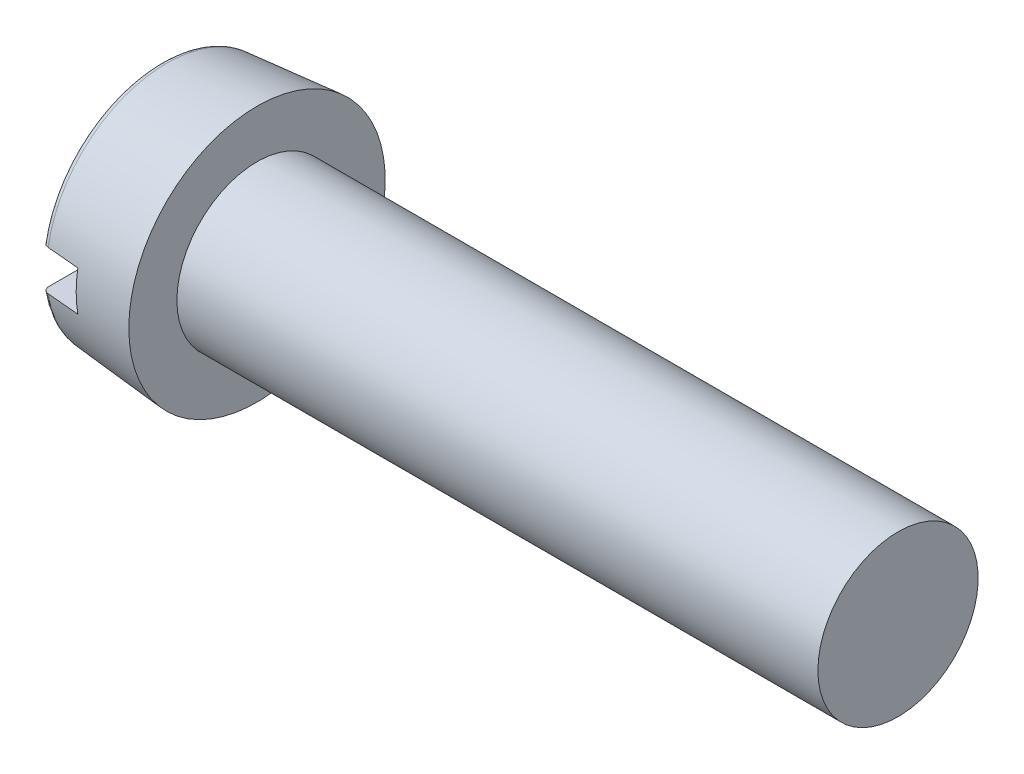
ISO-10303-21;
HEADER;
FILE_DESCRIPTION(('STEP AP214'),'2;1');
FILE_NAME('part.step','',(''),(''),'','','');
FILE_SCHEMA(('AUTOMOTIVE_DESIGN { 1 0 10303 214 1 1 1 1 }'));
ENDSEC;
DATA;
#1=APPLICATION_CONTEXT('core data for automotive mechanical design processes');
#2=APPLICATION_PROTOCOL_DEFINITION('international standard','automotive_design',2000,#1);
#3=PRODUCT_CONTEXT('',#1,'mechanical');
#4=PRODUCT('Part','Part','',(#3));
#5=PRODUCT_RELATED_PRODUCT_CATEGORY('part','',(#4));
#6=PRODUCT_DEFINITION_FORMATION('','',#4);
#7=PRODUCT_DEFINITION_CONTEXT('part definition',#1,'design');
#8=PRODUCT_DEFINITION('design','',#6,#7);
#9=PRODUCT_DEFINITION_SHAPE('','',#8);
#10=(LENGTH_UNIT() NAMED_UNIT(*) SI_UNIT(.MILLI.,.METRE.));
#11=(NAMED_UNIT(*) PLANE_ANGLE_UNIT() SI_UNIT($,.RADIAN.));
#12=(NAMED_UNIT(*) SI_UNIT($,.STERADIAN.) SOLID_ANGLE_UNIT());
#13=UNCERTAINTY_MEASURE_WITH_UNIT(LENGTH_MEASURE(1.E-05),#10,'distance_accuracy_value','');
#14=(GEOMETRIC_REPRESENTATION_CONTEXT(3) GLOBAL_UNCERTAINTY_ASSIGNED_CONTEXT((#13)) GLOBAL_UNIT_ASSIGNED_CONTEXT((#10,
#11,#12)) REPRESENTATION_CONTEXT('',''));
#15=CARTESIAN_POINT('',(0.,0.,0.));
#16=DIRECTION('',(0.,0.,1.));
#17=DIRECTION('',(1.,0.,0.));
#18=AXIS2_PLACEMENT_3D('',#15,#16,#17);
#19=CARTESIAN_POINT('',(0.,0.,0.));
#20=DIRECTION('',(-1.,0.,0.));
#21=DIRECTION('',(0.,0.,1.));
#22=AXIS2_PLACEMENT_3D('',#19,#20,#21);
#23=PLANE('',#22);
#24=DIRECTION('',(0.,0.,-1.));
#25=VECTOR('',#24,1.);
#26=CARTESIAN_POINT('',(0.,1.25,8.));
#27=LINE('',#26,#25);
#28=CARTESIAN_POINT('',(0.,1.25,6.99776947711005));
#29=VERTEX_POINT('',#28);
#30=CARTESIAN_POINT('',(0.,1.25,-6.99776947711005));
#31=VERTEX_POINT('',#30);
#32=EDGE_CURVE('E103',#29,#31,#27,.T.);
#33=ORIENTED_EDGE('',*,*,#32,.F.);
#34=CARTESIAN_POINT('',(0.,0.,0.));
#35=DIRECTION('',(-1.,0.,0.));
#36=DIRECTION('',(0.,0.,1.));
#37=AXIS2_PLACEMENT_3D('',#34,#35,#36);
#38=CIRCLE('',#37,7.10853554923749);
#39=EDGE_CURVE('E105',#29,#31,#38,.T.);
#40=ORIENTED_EDGE('',*,*,#39,.T.);
#41=EDGE_LOOP('',(#33,#40));
#42=FACE_BOUND('',#41,.T.);
#43=ADVANCED_FACE('F34',(#42),#23,.T.);
#44=CARTESIAN_POINT('',(0.4,0.,0.));
#45=DIRECTION('',(-1.,0.,0.));
#46=DIRECTION('',(0.,0.,1.));
#47=AXIS2_PLACEMENT_3D('',#44,#45,#46);
#48=TOROIDAL_SURFACE('',#47,7.10853554923749,0.4);
#49=CARTESIAN_POINT('',(0.132475757851242,1.25,-7.29965638920683));
#50=CARTESIAN_POINT('',(0.148990897621924,1.25,-7.31472881891581));
#51=CARTESIAN_POINT('',(0.166777881294841,1.25,-7.32842972983909));
#52=CARTESIAN_POINT('',(0.204409031787132,1.25,-7.35266985516961));
#53=CARTESIAN_POINT('',(0.224255314627321,1.25,-7.36320577324363));
#54=CARTESIAN_POINT('',(0.265441578513304,1.25,-7.38078477054969));
#55=CARTESIAN_POINT('',(0.286781544260905,1.25,-7.38782788554881));
#56=CARTESIAN_POINT('',(0.330340589192457,1.25,-7.39820117451271));
#57=CARTESIAN_POINT('',(0.352559458450429,1.25,-7.40153222962352));
#58=CARTESIAN_POINT('',(0.39708917143117,1.25,-7.40437165578085));
#59=CARTESIAN_POINT('',(0.419398381580468,1.25,-7.40390568201544));
#60=CARTESIAN_POINT('',(0.463620380604721,1.25,-7.39922637221389));
#61=CARTESIAN_POINT('',(0.485533165388407,1.25,-7.39501299752556));
#62=CARTESIAN_POINT('',(0.528297000664801,1.25,-7.38298011209517));
#63=CARTESIAN_POINT('',(0.549150081954697,1.25,-7.37516781180873));
#64=CARTESIAN_POINT('',(0.589260552146216,1.25,-7.35617509642101));
#65=CARTESIAN_POINT('',(0.608517909002185,1.25,-7.34499461370012));
#66=CARTESIAN_POINT('',(0.645030195575131,1.25,-7.31951314776873));
#67=CARTESIAN_POINT('',(0.662271267997444,1.25,-7.30519231684626));
#68=CARTESIAN_POINT('',(0.694141480066492,1.25,-7.27389212422684));
#69=CARTESIAN_POINT('',(0.708770469742369,1.25,-7.25691260998849));
#70=CARTESIAN_POINT('',(0.735200741007371,1.25,-7.22055032360003));
#71=CARTESIAN_POINT('',(0.746964034015804,1.25,-7.20113994322958));
#72=CARTESIAN_POINT('',(0.767117158400734,1.25,-7.16064078825307));
#73=CARTESIAN_POINT('',(0.775506732013764,1.25,-7.13955188554968));
#74=CARTESIAN_POINT('',(0.788794691260611,1.25,-7.09597716187255));
#75=CARTESIAN_POINT('',(0.793642419073202,1.25,-7.07347588788442));
#76=CARTESIAN_POINT('',(0.79953214299641,1.25,-7.02798039249649));
#77=CARTESIAN_POINT('',(0.800573894955184,1.25,-7.00498613956746));
#78=CARTESIAN_POINT('',(0.798819799422969,1.25,-6.95891765815873));
#79=CARTESIAN_POINT('',(0.795986208551347,1.25,-6.93584485763783));
#80=CARTESIAN_POINT('',(0.786490065073119,1.25,-6.89050028058394));
#81=CARTESIAN_POINT('',(0.779827421984436,1.25,-6.86822852299314));
#82=CARTESIAN_POINT('',(0.762840556829627,1.25,-6.82510415628482));
#83=CARTESIAN_POINT('',(0.752513126348179,1.25,-6.80425280982325));
#84=CARTESIAN_POINT('',(0.728472446619592,1.25,-6.76460179349236));
#85=CARTESIAN_POINT('',(0.714759325905055,1.25,-6.74580204577626));
#86=CARTESIAN_POINT('',(0.684465602199206,1.25,-6.71098630118125));
#87=CARTESIAN_POINT('',(0.667913273640775,1.25,-6.6949457139243));
#88=CARTESIAN_POINT('',(0.632312083704012,1.25,-6.66592631517133));
#89=CARTESIAN_POINT('',(0.613263446428398,1.25,-6.6529472291257));
#90=CARTESIAN_POINT('',(0.573538891572842,1.25,-6.63064399739937));
#91=CARTESIAN_POINT('',(0.552894182739908,1.25,-6.62126426760379));
#92=CARTESIAN_POINT('',(0.510307149284166,1.25,-6.60616480480813));
#93=CARTESIAN_POINT('',(0.488364949360132,1.25,-6.60044472071074));
#94=CARTESIAN_POINT('',(0.444162761193555,1.25,-6.59290706118034));
#95=CARTESIAN_POINT('',(0.421912606208707,1.25,-6.59103174193421));
#96=CARTESIAN_POINT('',(0.377416152087141,1.25,-6.59106992730099));
#97=CARTESIAN_POINT('',(0.355169852812418,1.25,-6.59298324051332));
#98=CARTESIAN_POINT('',(0.311460904564096,1.25,-6.60051294905758));
#99=CARTESIAN_POINT('',(0.289994153751729,1.25,-6.60610558358587));
#100=CARTESIAN_POINT('',(0.248296537877981,1.25,-6.62079614911604));
#101=CARTESIAN_POINT('',(0.228065690020258,1.25,-6.62989412889913));
#102=CARTESIAN_POINT('',(0.189287061711009,1.25,-6.65137810360546));
#103=CARTESIAN_POINT('',(0.170749207935741,1.25,-6.66378200409108));
#104=CARTESIAN_POINT('',(0.135980816965005,1.25,-6.69148453530517));
#105=CARTESIAN_POINT('',(0.119750439938384,1.25,-6.7067833668078));
#106=CARTESIAN_POINT('',(0.0898040664840912,1.25,-6.74007476174574));
#107=CARTESIAN_POINT('',(0.0761278328779842,1.25,-6.75810308616994));
#108=CARTESIAN_POINT('',(0.0519386525453923,1.25,-6.79616955089394));
#109=CARTESIAN_POINT('',(0.0414259875683513,1.25,-6.81620786999337));
#110=CARTESIAN_POINT('',(0.0236867380797454,1.25,-6.85807628140989));
#111=CARTESIAN_POINT('',(0.0165164719189096,1.25,-6.87993024376501));
#112=CARTESIAN_POINT('',(0.00590326393424353,1.25,-6.92452467717087));
#113=CARTESIAN_POINT('',(0.0024604347498389,1.25,-6.94726517499031));
#114=CARTESIAN_POINT('',(-0.000624459766422521,1.25,-6.9932443247362));
#115=CARTESIAN_POINT('',(-0.000226065366074415,1.25,-7.01648570101166));
#116=CARTESIAN_POINT('',(0.00446361451723194,1.25,-7.06257934530914));
#117=CARTESIAN_POINT('',(0.00875592787281217,1.25,-7.08543150896849));
#118=CARTESIAN_POINT('',(0.021132661407696,1.25,-7.13011343430797));
#119=CARTESIAN_POINT('',(0.0292216504618883,1.25,-7.15194192921092));
#120=CARTESIAN_POINT('',(0.0489774391967388,1.25,-7.1938938761873));
#121=CARTESIAN_POINT('',(0.0606398350164918,1.25,-7.21401938826937));
#122=CARTESIAN_POINT('',(0.0824216895075313,1.25,-7.24513458851208));
#123=CARTESIAN_POINT('',(0.0915853127783246,1.25,-7.25680502700719));
#124=CARTESIAN_POINT('',(0.111138238992433,1.25,-7.27907001287354));
#125=CARTESIAN_POINT('',(0.121527533918578,1.25,-7.28966456728134));
#126=CARTESIAN_POINT('',(0.132475757851242,1.25,-7.29965638920683));
#127=B_SPLINE_CURVE_WITH_KNOTS('',3,(#49,#50,#51,#52,#53,#54,#55,#56,#57,#58,#59,#60,#61,#62,
#63,#64,#65,#66,#67,#68,#69,#70,#71,#72,#73,#74,#75,#76,#77,#78,#79,#80,#81,#82,#83,#84,#85,#86,
#87,#88,#89,#90,#91,#92,#93,#94,#95,#96,#97,#98,#99,#100,#101,#102,#103,#104,#105,#106,#107,
#108,#109,#110,#111,#112,#113,#114,#115,#116,#117,#118,#119,#120,#121,#122,#123,#124,#125,#126),
.UNSPECIFIED.,.T.,.F.,(4,2,2,2,2,2,2,2,2,2,2,2,2,2,2,2,2,2,2,2,2,2,2,2,2,2,2,2,2,2,2,2,2,2,2,2,
2,2,4),(0.,0.0670239474370827,0.134117460064762,0.20121028562602,0.268287181709055,
0.334911240528258,0.401535986542785,0.468027826397758,0.534521001231533,0.601447204965561,
0.668377249984879,0.736151387461508,0.80393070212598,0.872661416043641,0.94139653893194,
1.01080588702663,1.08021687536021,1.1496887815358,1.21915805072109,1.28797189943469,
1.35677957470518,1.4244772379088,1.49216840539284,1.55883525520835,1.62549873712052,
1.69173588198359,1.75797394865169,1.82457833392021,1.891187340143,1.95875976356851,
2.02633820325739,2.09501746622971,2.1636988045629,2.23310434939736,2.30252822045407,
2.37203585042133,2.44145816150725,2.48588999769625,2.53032154327087),.UNSPECIFIED.);
#128=CARTESIAN_POINT('',(0.365137702900947,1.25,-7.40221254864326));
#129=VERTEX_POINT('',#128);
#130=EDGE_CURVE('E58',#31,#129,#127,.T.);
#131=ORIENTED_EDGE('',*,*,#130,.F.);
#132=ORIENTED_EDGE('',*,*,#39,.F.);
#133=CARTESIAN_POINT('',(0.15668547543374,1.25,6.67501605941856));
#134=CARTESIAN_POINT('',(0.174256159303532,1.25,6.66131739515298));
#135=CARTESIAN_POINT('',(0.192982327946099,1.25,6.64907708297098));
#136=CARTESIAN_POINT('',(0.232233891126256,1.25,6.62789477827826));
#137=CARTESIAN_POINT('',(0.252761075755445,1.25,6.61895611441974));
#138=CARTESIAN_POINT('',(0.295032574209204,1.25,6.60466535626898));
#139=CARTESIAN_POINT('',(0.316776963415687,1.25,6.59931348437491));
#140=CARTESIAN_POINT('',(0.360853110751047,1.25,6.592369981554));
#141=CARTESIAN_POINT('',(0.383184728507424,1.25,6.59077746009831));
#142=CARTESIAN_POINT('',(0.42762602463069,1.25,6.591398255291));
#143=CARTESIAN_POINT('',(0.44973610726058,1.25,6.59358298057135));
#144=CARTESIAN_POINT('',(0.493275240676115,1.25,6.60163431657699));
#145=CARTESIAN_POINT('',(0.514704279009804,1.25,6.60750099458108));
#146=CARTESIAN_POINT('',(0.556279482036226,1.25,6.6227333590536));
#147=CARTESIAN_POINT('',(0.576425624689502,1.25,6.63209910561517));
#148=CARTESIAN_POINT('',(0.614883023334556,1.25,6.65404433089509));
#149=CARTESIAN_POINT('',(0.633194197586673,1.25,6.66662395268872));
#150=CARTESIAN_POINT('',(0.667684143428595,1.25,6.69478087139315));
#151=CARTESIAN_POINT('',(0.683837122103321,1.25,6.71038975020607));
#152=CARTESIAN_POINT('',(0.713345175550784,1.25,6.7440588981787));
#153=CARTESIAN_POINT('',(0.726700022224971,1.25,6.76211936698988));
#154=CARTESIAN_POINT('',(0.750464904974419,1.25,6.80049672559191));
#155=CARTESIAN_POINT('',(0.760822936349284,1.25,6.82084582110235));
#156=CARTESIAN_POINT('',(0.778030188063439,1.25,6.86297712706654));
#157=CARTESIAN_POINT('',(0.784879119165087,1.25,6.88475945548761));
#158=CARTESIAN_POINT('',(0.794964107284589,1.25,6.92946740352524));
#159=CARTESIAN_POINT('',(0.798148099408991,1.25,6.95240477979508));
#160=CARTESIAN_POINT('',(0.800643926161286,1.25,6.99848978874241));
#161=CARTESIAN_POINT('',(0.799955588488735,1.25,7.02163743072997));
#162=CARTESIAN_POINT('',(0.794705675750331,1.25,7.06762095989773));
#163=CARTESIAN_POINT('',(0.790122565247042,1.25,7.0904543949755));
#164=CARTESIAN_POINT('',(0.777170147100338,1.25,7.13502176959932));
#165=CARTESIAN_POINT('',(0.768800881112193,1.25,7.15675572123895));
#166=CARTESIAN_POINT('',(0.748544042631801,1.25,7.19839107273167));
#167=CARTESIAN_POINT('',(0.736673273356225,1.25,7.2183006427163));
#168=CARTESIAN_POINT('',(0.709718494132742,1.25,7.25581170148191));
#169=CARTESIAN_POINT('',(0.69463467915737,1.25,7.27341333020764));
#170=CARTESIAN_POINT('',(0.661876766777085,1.25,7.30557422970805));
#171=CARTESIAN_POINT('',(0.644236726182383,1.25,7.32016818300082));
#172=CARTESIAN_POINT('',(0.606727108706936,1.25,7.34613622824434));
#173=CARTESIAN_POINT('',(0.586857713181622,1.25,7.35751058184097));
#174=CARTESIAN_POINT('',(0.545758386659378,1.25,7.37654767607346));
#175=CARTESIAN_POINT('',(0.52455188547623,1.25,7.38426101059351));
#176=CARTESIAN_POINT('',(0.481137369986091,1.25,7.39597548572668));
#177=CARTESIAN_POINT('',(0.458929423064878,1.25,7.39997687572127));
#178=CARTESIAN_POINT('',(0.414390919699603,1.25,7.40412092171349));
#179=CARTESIAN_POINT('',(0.392064060347182,1.25,7.40430340438234));
#180=CARTESIAN_POINT('',(0.347698997771154,1.25,7.40090585182088));
#181=CARTESIAN_POINT('',(0.325660786551402,1.25,7.39732592104129));
#182=CARTESIAN_POINT('',(0.282559333987194,1.25,7.38652855146359));
#183=CARTESIAN_POINT('',(0.261493590175769,1.25,7.37932109134644));
#184=CARTESIAN_POINT('',(0.220861145751318,1.25,7.36149175034701));
#185=CARTESIAN_POINT('',(0.201294470903542,1.25,7.35086981079467));
#186=CARTESIAN_POINT('',(0.164087631579857,1.25,7.32645533967974));
#187=CARTESIAN_POINT('',(0.146459378547664,1.25,7.31264466361359));
#188=CARTESIAN_POINT('',(0.113736669907922,1.25,7.28229253500387));
#189=CARTESIAN_POINT('',(0.0986423616704059,1.25,7.26575092374452));
#190=CARTESIAN_POINT('',(0.0712157313160402,1.25,7.23019262746298));
#191=CARTESIAN_POINT('',(0.0589194924711632,1.25,7.2111481157354));
#192=CARTESIAN_POINT('',(0.0376470058691976,1.25,7.17128762730619));
#193=CARTESIAN_POINT('',(0.0286710136944299,1.25,7.15047151438383));
#194=CARTESIAN_POINT('',(0.0141628053019194,1.25,7.10734319168297));
#195=CARTESIAN_POINT('',(0.00868112271792404,1.25,7.08501397826919));
#196=CARTESIAN_POINT('',(0.00150168989728186,1.25,7.03975592454705));
#197=CARTESIAN_POINT('',(-0.000195951984188094,1.25,7.01682706708704));
#198=CARTESIAN_POINT('',(0.000234132857482004,1.25,6.97076875747737));
#199=CARTESIAN_POINT('',(0.00240136616642189,1.25,6.94763966646712));
#200=CARTESIAN_POINT('',(0.0105811179928993,1.25,6.9020645604744));
#201=CARTESIAN_POINT('',(0.0165946803878747,1.25,6.87961873265961));
#202=CARTESIAN_POINT('',(0.0323258291359139,1.25,6.83600920141137));
#203=CARTESIAN_POINT('',(0.0420516558656513,1.25,6.81484847261108));
#204=CARTESIAN_POINT('',(0.0649421422737633,1.25,6.77449865666217));
#205=CARTESIAN_POINT('',(0.0781025928825361,1.25,6.75530719604028));
#206=CARTESIAN_POINT('',(0.102248587863912,1.25,6.72585361952537));
#207=CARTESIAN_POINT('',(0.112339169250733,1.25,6.7148457792954));
#208=CARTESIAN_POINT('',(0.133675681220594,1.25,6.69401274789932));
#209=CARTESIAN_POINT('',(0.144921603546838,1.25,6.68418754828241));
#210=CARTESIAN_POINT('',(0.15668547543374,1.25,6.67501605941856));
#211=B_SPLINE_CURVE_WITH_KNOTS('',3,(#133,#134,#135,#136,#137,#138,#139,#140,#141,#142,#143,
#144,#145,#146,#147,#148,#149,#150,#151,#152,#153,#154,#155,#156,#157,#158,#159,#160,#161,#162,
#163,#164,#165,#166,#167,#168,#169,#170,#171,#172,#173,#174,#175,#176,#177,#178,#179,#180,#181,
#182,#183,#184,#185,#186,#187,#188,#189,#190,#191,#192,#193,#194,#195,#196,#197,#198,#199,#200,
#201,#202,#203,#204,#205,#206,#207,#208,#209,#210),.UNSPECIFIED.,.T.,.F.,(4,2,2,2,2,2,2,2,2,2,2,
2,2,2,2,2,2,2,2,2,2,2,2,2,2,2,2,2,2,2,2,2,2,2,2,2,2,2,4),(0.,0.066785475114619,
0.133638099335042,0.200494868352655,0.267335798501467,0.333672997488887,0.400011408663613,
0.46635095918919,0.532693463533563,0.599768896320274,0.66684979484677,0.735033157451876,
0.803222139167889,0.872368316224059,0.941517569983865,1.01105167849204,1.08058502200478,
1.14978996796151,1.2189907156518,1.28734229694064,1.35568832193367,1.42306015167362,
1.49042745480941,1.55709184276737,1.62375438006253,1.69023453483983,1.75671583198866,
1.82358517290829,1.89045840149177,1.9581504823165,2.02584777278445,2.09450310821731,
2.1631604095554,2.23252355050272,2.30190552430527,2.37144241440476,2.4408944852132,
2.48560881696134,2.53032282917489),.UNSPECIFIED.);
#212=CARTESIAN_POINT('',(0.365137702900947,1.25,7.40221254864326));
#213=VERTEX_POINT('',#212);
#214=EDGE_CURVE('E95',#213,#29,#211,.T.);
#215=ORIENTED_EDGE('',*,*,#214,.F.);
#216=CARTESIAN_POINT('',(0.365137702900947,0.,0.));
#217=DIRECTION('',(-1.,0.,0.));
#218=DIRECTION('',(0.,0.,1.));
#219=AXIS2_PLACEMENT_3D('',#216,#217,#218);
#220=CIRCLE('',#219,7.50701342847418);
#221=EDGE_CURVE('E109',#129,#213,#220,.F.);
#222=ORIENTED_EDGE('',*,*,#221,.F.);
#223=EDGE_LOOP('',(#131,#132,#215,#222));
#224=FACE_BOUND('',#223,.T.);
#225=ADVANCED_FACE('F179',(#224),#48,.T.);
#226=CARTESIAN_POINT('',(-25.4,0.,0.));
#227=DIRECTION('',(-1.,0.,0.));
#228=DIRECTION('',(0.,0.,1.));
#229=AXIS2_PLACEMENT_3D('',#226,#227,#228);
#230=CYLINDRICAL_SURFACE('',#229,5.);
#231=CARTESIAN_POINT('',(46.,0.,0.));
#232=DIRECTION('',(-1.,0.,0.));
#233=DIRECTION('',(0.,0.,1.));
#234=AXIS2_PLACEMENT_3D('',#231,#232,#233);
#235=CIRCLE('',#234,5.);
#236=CARTESIAN_POINT('',(46.,0.,5.));
#237=VERTEX_POINT('',#236);
#238=EDGE_CURVE('E167',#237,#237,#235,.T.);
#239=ORIENTED_EDGE('',*,*,#238,.T.);
#240=EDGE_LOOP('',(#239));
#241=FACE_BOUND('',#240,.T.);
#242=CARTESIAN_POINT('',(6.,0.,0.));
#243=DIRECTION('',(-1.,0.,0.));
#244=DIRECTION('',(0.,0.,1.));
#245=AXIS2_PLACEMENT_3D('',#242,#243,#244);
#246=CIRCLE('',#245,5.);
#247=CARTESIAN_POINT('',(6.,0.,5.));
#248=VERTEX_POINT('',#247);
#249=EDGE_CURVE('E106',#248,#248,#246,.T.);
#250=ORIENTED_EDGE('',*,*,#249,.F.);
#251=EDGE_LOOP('',(#250));
#252=FACE_BOUND('',#251,.T.);
#253=ADVANCED_FACE('F175',(#241,#252),#230,.T.);
#254=CARTESIAN_POINT('',(6.,5.,0.));
#255=DIRECTION('',(-1.,0.,0.));
#256=DIRECTION('',(0.,0.,1.));
#257=AXIS2_PLACEMENT_3D('',#254,#255,#256);
#258=PLANE('',#257);
#259=CARTESIAN_POINT('',(6.,0.,0.));
#260=DIRECTION('',(-1.,0.,0.));
#261=DIRECTION('',(0.,0.,1.));
#262=AXIS2_PLACEMENT_3D('',#259,#260,#261);
#263=CIRCLE('',#262,8.);
#264=CARTESIAN_POINT('',(6.,0.,8.));
#265=VERTEX_POINT('',#264);
#266=EDGE_CURVE('E111',#265,#265,#263,.T.);
#267=ORIENTED_EDGE('',*,*,#266,.F.);
#268=EDGE_LOOP('',(#267));
#269=FACE_BOUND('',#268,.T.);
#270=ORIENTED_EDGE('',*,*,#249,.T.);
#271=EDGE_LOOP('',(#270));
#272=FACE_BOUND('',#271,.T.);
#273=ADVANCED_FACE('F152',(#269,#272),#258,.F.);
#274=CARTESIAN_POINT('',(0.,0.,0.));
#275=DIRECTION('',(1.,0.,0.));
#276=DIRECTION('',(0.,0.,-1.));
#277=AXIS2_PLACEMENT_3D('',#274,#275,#276);
#278=CONICAL_SURFACE('',#277,7.47506801884446,0.0872664625997167);
#279=CARTESIAN_POINT('',(-12.6477013748277,1.25,-6.24465933873312));
#280=CARTESIAN_POINT('',(-8.75782940243838,1.25,-6.59168512042369));
#281=CARTESIAN_POINT('',(-4.86786867820199,1.25,-6.93771339321176));
#282=CARTESIAN_POINT('',(-0.235140087383208,1.25,-7.34895529630409));
#283=CARTESIAN_POINT('',(0.507566572928586,1.25,-7.41485821615409));
#284=CARTESIAN_POINT('',(5.88303167466397,1.25,-7.89166585007388));
#285=CARTESIAN_POINT('',(10.5158712372773,1.25,-8.30165647227328));
#286=CARTESIAN_POINT('',(15.1487514451113,1.25,-8.71118545426366));
#287=B_SPLINE_CURVE_WITH_KNOTS('',3,(#279,#280,#281,#282,#283,#284,#285,#286),.UNSPECIFIED.,.F.,
.F.,(4,2,2,4),(0.,11.7159620606892,13.952836531243,27.9056728187091),.UNSPECIFIED.);
#288=CARTESIAN_POINT('',(2.4,1.25,-7.58270085599116));
#289=VERTEX_POINT('',#288);
#290=EDGE_CURVE('E162',#129,#289,#287,.T.);
#291=ORIENTED_EDGE('',*,*,#290,.F.);
#292=ORIENTED_EDGE('',*,*,#221,.T.);
#293=CARTESIAN_POINT('',(15.1487514451113,1.25,8.71118545426366));
#294=CARTESIAN_POINT('',(12.8323092785842,1.25,8.50644348503834));
#295=CARTESIAN_POINT('',(10.5158792228145,1.25,8.3015643670677));
#296=CARTESIAN_POINT('',(5.88305125623619,1.25,7.89144412793247));
#297=CARTESIAN_POINT('',(3.56665334542618,1.25,7.68620300678283));
#298=CARTESIAN_POINT('',(-1.06610264205619,1.25,7.2752710348812));
#299=CARTESIAN_POINT('',(-3.38246071872782,1.25,7.06958018412085));
#300=CARTESIAN_POINT('',(-8.01512399889968,1.25,6.65760290416425));
#301=CARTESIAN_POINT('',(-10.3314292023977,1.25,6.45131647494319));
#302=CARTESIAN_POINT('',(-12.6477013748277,1.25,6.24465933873312));
#303=B_SPLINE_CURVE_WITH_KNOTS('',3,(#293,#294,#295,#296,#297,#298,#299,#300,#301,#302),
.UNSPECIFIED.,.F.,.F.,(4,2,2,2,4),(0.,6.97641830905729,13.9528363300637,20.9292544805163,
27.9056729214705),.UNSPECIFIED.);
#304=CARTESIAN_POINT('',(2.4,1.25,7.58270085599116));
#305=VERTEX_POINT('',#304);
#306=EDGE_CURVE('E158',#305,#213,#303,.T.);
#307=ORIENTED_EDGE('',*,*,#306,.F.);
#308=CARTESIAN_POINT('',(2.4,0.,0.));
#309=DIRECTION('',(-1.,0.,0.));
#310=DIRECTION('',(0.,0.,1.));
#311=AXIS2_PLACEMENT_3D('',#308,#309,#310);
#312=CIRCLE('',#311,7.68504081130667);
#313=CARTESIAN_POINT('',(2.4,-1.25,7.58270085599116));
#314=VERTEX_POINT('',#313);
#315=EDGE_CURVE('E39',#305,#314,#312,.F.);
#316=ORIENTED_EDGE('',*,*,#315,.T.);
#317=CARTESIAN_POINT('',(-12.6477013748277,-1.25,6.24465933873311));
#318=CARTESIAN_POINT('',(-8.75782940243838,-1.25,6.59168512042369));
#319=CARTESIAN_POINT('',(-4.86786867820199,-1.25,6.93771339321176));
#320=CARTESIAN_POINT('',(-0.235140087383208,-1.25,7.34895529630409));
#321=CARTESIAN_POINT('',(0.507566572928586,-1.25,7.41485821615409));
#322=CARTESIAN_POINT('',(5.88303167466397,-1.25,7.89166585007388));
#323=CARTESIAN_POINT('',(10.5158712372773,-1.25,8.30165647227327));
#324=CARTESIAN_POINT('',(15.1487514451113,-1.25,8.71118545426366));
#325=B_SPLINE_CURVE_WITH_KNOTS('',3,(#317,#318,#319,#320,#321,#322,#323,#324),.UNSPECIFIED.,.F.,
.F.,(4,2,2,4),(0.,11.7159620606892,13.952836531243,27.9056728187091),.UNSPECIFIED.);
#326=CARTESIAN_POINT('',(0.365137702900947,-1.25,7.40221254864326));
#327=VERTEX_POINT('',#326);
#328=EDGE_CURVE('E136',#327,#314,#325,.T.);
#329=ORIENTED_EDGE('',*,*,#328,.F.);
#330=CARTESIAN_POINT('',(0.365137702899819,-1.25,-7.40221254864822));
#331=VERTEX_POINT('',#330);
#332=EDGE_CURVE('E115',#327,#331,#220,.F.);
#333=ORIENTED_EDGE('',*,*,#332,.T.);
#334=CARTESIAN_POINT('',(15.1487514451113,-1.25,-8.71118545426366));
#335=CARTESIAN_POINT('',(12.8323092785842,-1.25,-8.50644348503834));
#336=CARTESIAN_POINT('',(10.5158792228145,-1.25,-8.3015643670677));
#337=CARTESIAN_POINT('',(5.88305125623619,-1.25,-7.89144412793247));
#338=CARTESIAN_POINT('',(3.56665334542618,-1.25,-7.68620300678283));
#339=CARTESIAN_POINT('',(-1.06610264205619,-1.25,-7.2752710348812));
#340=CARTESIAN_POINT('',(-3.38246071872781,-1.25,-7.06958018412085));
#341=CARTESIAN_POINT('',(-8.01512399889968,-1.25,-6.65760290416425));
#342=CARTESIAN_POINT('',(-10.3314292023977,-1.25,-6.45131647494319));
#343=CARTESIAN_POINT('',(-12.6477013748277,-1.25,-6.24465933873312));
#344=B_SPLINE_CURVE_WITH_KNOTS('',3,(#334,#335,#336,#337,#338,#339,#340,#341,#342,#343),
.UNSPECIFIED.,.F.,.F.,(4,2,2,2,4),(0.,6.97641830905729,13.9528363300637,20.9292544805163,
27.9056729214705),.UNSPECIFIED.);
#345=CARTESIAN_POINT('',(2.4,-1.25,-7.58270085599116));
#346=VERTEX_POINT('',#345);
#347=EDGE_CURVE('E90',#346,#331,#344,.T.);
#348=ORIENTED_EDGE('',*,*,#347,.F.);
#349=EDGE_CURVE('E11',#346,#289,#312,.F.);
#350=ORIENTED_EDGE('',*,*,#349,.T.);
#351=EDGE_LOOP('',(#291,#292,#307,#316,#329,#333,#348,#350));
#352=FACE_BOUND('',#351,.T.);
#353=ORIENTED_EDGE('',*,*,#266,.T.);
#354=EDGE_LOOP('',(#353));
#355=FACE_BOUND('',#354,.T.);
#356=ADVANCED_FACE('F147',(#352,#355),#278,.T.);
#357=DIRECTION('',(0.,0.,1.));
#358=VECTOR('',#357,1.);
#359=CARTESIAN_POINT('',(0.,-1.25,-8.));
#360=LINE('',#359,#358);
#361=CARTESIAN_POINT('',(0.,-1.25,-6.99776947711005));
#362=VERTEX_POINT('',#361);
#363=CARTESIAN_POINT('',(0.,-1.25,6.99776947711005));
#364=VERTEX_POINT('',#363);
#365=EDGE_CURVE('E50',#362,#364,#360,.T.);
#366=ORIENTED_EDGE('',*,*,#365,.F.);
#367=EDGE_CURVE('E101',#362,#364,#38,.T.);
#368=ORIENTED_EDGE('',*,*,#367,.T.);
#369=EDGE_LOOP('',(#366,#368));
#370=FACE_BOUND('',#369,.T.);
#371=ADVANCED_FACE('F100',(#370),#23,.T.);
#372=CARTESIAN_POINT('',(46.,5.,0.));
#373=DIRECTION('',(1.,0.,0.));
#374=DIRECTION('',(0.,0.,-1.));
#375=AXIS2_PLACEMENT_3D('',#372,#373,#374);
#376=PLANE('',#375);
#377=ORIENTED_EDGE('',*,*,#238,.F.);
#378=EDGE_LOOP('',(#377));
#379=FACE_BOUND('',#378,.T.);
#380=ADVANCED_FACE('F191',(#379),#376,.T.);
#381=CARTESIAN_POINT('',(0.132475757851242,-1.25,-7.29965638920683));
#382=CARTESIAN_POINT('',(0.115625040362421,-1.25,-7.28427494478596));
#383=CARTESIAN_POINT('',(0.100074059015625,-1.25,-7.26744265223299));
#384=CARTESIAN_POINT('',(0.0720165003870288,-1.25,-7.2313837560944));
#385=CARTESIAN_POINT('',(0.0595141565561301,-1.25,-7.21215387846969));
#386=CARTESIAN_POINT('',(0.0379148090689056,-1.25,-7.17189363601678));
#387=CARTESIAN_POINT('',(0.0288141980328785,-1.25,-7.15086520772418));
#388=CARTESIAN_POINT('',(0.0142370587616715,-1.25,-7.10759561886651));
#389=CARTESIAN_POINT('',(0.00875961454539266,-1.25,-7.08535476635741));
#390=CARTESIAN_POINT('',(0.00152481935038803,-1.25,-7.04005432155938));
#391=CARTESIAN_POINT('',(-0.000195927620115716,-1.25,-7.01698887975879));
#392=CARTESIAN_POINT('',(0.000231445843902819,-1.25,-6.9708922567112));
#393=CARTESIAN_POINT('',(0.00237993444738624,-1.25,-6.94786107893321));
#394=CARTESIAN_POINT('',(0.0105153144579516,-1.25,-6.90232994745226));
#395=CARTESIAN_POINT('',(0.0165272777527609,-1.25,-6.87983446628693));
#396=CARTESIAN_POINT('',(0.0322550194672577,-1.25,-6.83617683216891));
#397=CARTESIAN_POINT('',(0.0419707884359014,-1.25,-6.81501467581412));
#398=CARTESIAN_POINT('',(0.0648081023002403,-1.25,-6.77471156724313));
#399=CARTESIAN_POINT('',(0.0779176887025827,-1.25,-6.75556384359851));
#400=CARTESIAN_POINT('',(0.107204453476479,-1.25,-6.71977775964522));
#401=CARTESIAN_POINT('',(0.123381432436709,-1.25,-6.70313923633949));
#402=CARTESIAN_POINT('',(0.158125347658664,-1.25,-6.6730806059242));
#403=CARTESIAN_POINT('',(0.176658678711015,-1.25,-6.65962166787759));
#404=CARTESIAN_POINT('',(0.215753126806998,-1.25,-6.63606890203423));
#405=CARTESIAN_POINT('',(0.236314045160466,-1.25,-6.62597474493496));
#406=CARTESIAN_POINT('',(0.278509253122814,-1.25,-6.60961442456759));
#407=CARTESIAN_POINT('',(0.300119757662193,-1.25,-6.60328690024454));
#408=CARTESIAN_POINT('',(0.344101875795768,-1.25,-6.59440049659796));
#409=CARTESIAN_POINT('',(0.366473426294099,-1.25,-6.59184130562936));
#410=CARTESIAN_POINT('',(0.411048644748194,-1.25,-6.59058150765004));
#411=CARTESIAN_POINT('',(0.433250997786942,-1.25,-6.59183387410952));
#412=CARTESIAN_POINT('',(0.477127988833052,-1.25,-6.59805510152019));
#413=CARTESIAN_POINT('',(0.498802639460557,-1.25,-6.60302387350225));
#414=CARTESIAN_POINT('',(0.540980405247252,-1.25,-6.61651171952619));
#415=CARTESIAN_POINT('',(0.561485226466044,-1.25,-6.62502546491142));
#416=CARTESIAN_POINT('',(0.600794036069702,-1.25,-6.64534193261065));
#417=CARTESIAN_POINT('',(0.619597956828431,-1.25,-6.65714478562028));
#418=CARTESIAN_POINT('',(0.655176647454046,-1.25,-6.68382050758425));
#419=CARTESIAN_POINT('',(0.671929496567028,-1.25,-6.6987226001281));
#420=CARTESIAN_POINT('',(0.70274485496089,-1.25,-6.73108753174867));
#421=CARTESIAN_POINT('',(0.716807147901238,-1.25,-6.74855057654556));
#422=CARTESIAN_POINT('',(0.742084320816451,-1.25,-6.78584352675157));
#423=CARTESIAN_POINT('',(0.753249435955036,-1.25,-6.8057071629795));
#424=CARTESIAN_POINT('',(0.772142529395971,-1.25,-6.84700674749482));
#425=CARTESIAN_POINT('',(0.779870219978358,-1.25,-6.86844282722431));
#426=CARTESIAN_POINT('',(0.79177945431465,-1.25,-6.91261830559197));
#427=CARTESIAN_POINT('',(0.795907073868748,-1.25,-6.93537225334012));
#428=CARTESIAN_POINT('',(0.800312643316915,-1.25,-6.98125033815661));
#429=CARTESIAN_POINT('',(0.800590395635097,-1.25,-7.00437449416312));
#430=CARTESIAN_POINT('',(0.797273867060761,-1.25,-7.05050308750089));
#431=CARTESIAN_POINT('',(0.793653176994532,-1.25,-7.07350563402685));
#432=CARTESIAN_POINT('',(0.782588175295822,-1.25,-7.11857275805908));
#433=CARTESIAN_POINT('',(0.775143883026509,-1.25,-7.1406373403147));
#434=CARTESIAN_POINT('',(0.756658040298672,-1.25,-7.18311323496708));
#435=CARTESIAN_POINT('',(0.745629210669278,-1.25,-7.2035300796275));
#436=CARTESIAN_POINT('',(0.720262054212793,-1.25,-7.24219335576175));
#437=CARTESIAN_POINT('',(0.705923905403463,-1.25,-7.26043990390207));
#438=CARTESIAN_POINT('',(0.674518861980428,-1.25,-7.29401378642842));
#439=CARTESIAN_POINT('',(0.657485562882452,-1.25,-7.30937253881085));
#440=CARTESIAN_POINT('',(0.621049963824925,-1.25,-7.33696221917133));
#441=CARTESIAN_POINT('',(0.601647850424649,-1.25,-7.34919339323171));
#442=CARTESIAN_POINT('',(0.561324454022754,-1.25,-7.3699966793888));
#443=CARTESIAN_POINT('',(0.540428912119615,-1.25,-7.37861869376955));
#444=CARTESIAN_POINT('',(0.49747763732769,-1.25,-7.39218682476833));
#445=CARTESIAN_POINT('',(0.475422033550022,-1.25,-7.39713334953334));
#446=CARTESIAN_POINT('',(0.431043185392035,-1.25,-7.4031624417483));
#447=CARTESIAN_POINT('',(0.408725766558691,-1.25,-7.40428796643183));
#448=CARTESIAN_POINT('',(0.364214864075606,-1.25,-7.40276022353986));
#449=CARTESIAN_POINT('',(0.34202140898667,-1.25,-7.40010611850512));
#450=CARTESIAN_POINT('',(0.298473233341909,-1.25,-7.39111627011785));
#451=CARTESIAN_POINT('',(0.277115972416025,-1.25,-7.38479278118095));
#452=CARTESIAN_POINT('',(0.235778314998555,-1.25,-7.36866899219847));
#453=CARTESIAN_POINT('',(0.215796275363142,-1.25,-7.35887293050926));
#454=CARTESIAN_POINT('',(0.185293913158733,-1.25,-7.34062461551762));
#455=CARTESIAN_POINT('',(0.174160231620118,-1.25,-7.33317637058572));
#456=CARTESIAN_POINT('',(0.152693853687584,-1.25,-7.31720397979133));
#457=CARTESIAN_POINT('',(0.142361151919623,-1.25,-7.30867984114839));
#458=CARTESIAN_POINT('',(0.132475757851242,-1.25,-7.29965638920683));
#459=B_SPLINE_CURVE_WITH_KNOTS('',3,(#381,#382,#383,#384,#385,#386,#387,#388,#389,#390,#391,
#392,#393,#394,#395,#396,#397,#398,#399,#400,#401,#402,#403,#404,#405,#406,#407,#408,#409,#410,
#411,#412,#413,#414,#415,#416,#417,#418,#419,#420,#421,#422,#423,#424,#425,#426,#427,#428,#429,
#430,#431,#432,#433,#434,#435,#436,#437,#438,#439,#440,#441,#442,#443,#444,#445,#446,#447,#448,
#449,#450,#451,#452,#453,#454,#455,#456,#457,#458),.UNSPECIFIED.,.T.,.F.,(4,2,2,2,2,2,2,2,2,2,2,
2,2,2,2,2,2,2,2,2,2,2,2,2,2,2,2,2,2,2,2,2,2,2,2,2,2,2,4),(0.,0.0683960409883188,
0.136886525182522,0.205304170943184,0.273704513264643,0.342768405603915,0.411838869919614,
0.481362154098112,0.55088526087443,0.620166652794581,0.689443542271651,0.757824718204414,
0.826199199879751,0.893426955133864,0.960649150270628,1.02704534253903,1.09343994536222,
1.1597351048216,1.22603289895412,1.29298674274364,1.35994596785492,1.42798884247293,
1.49603741135732,1.56508856570231,1.63414326375197,1.70366871864894,1.77319382146436,
1.84247483899998,1.91175213057941,1.98022551766673,2.04869351551136,2.11618078943054,
2.1836605680639,2.25037915352088,2.3171125242332,2.38362430187781,2.45005517827328,
2.49017966288863,2.53030387827205),.UNSPECIFIED.);
#460=EDGE_CURVE('E86',#331,#362,#459,.T.);
#461=ORIENTED_EDGE('',*,*,#460,.F.);
#462=ORIENTED_EDGE('',*,*,#332,.F.);
#463=CARTESIAN_POINT('',(0.156685475433739,-1.25,6.67501605941856));
#464=CARTESIAN_POINT('',(0.13869744865346,-1.25,6.68904266390405));
#465=CARTESIAN_POINT('',(0.121894402396225,-1.25,6.70461880219441));
#466=CARTESIAN_POINT('',(0.0911386342070342,-1.25,6.73839410483411));
#467=CARTESIAN_POINT('',(0.077189971769284,-1.25,6.75659694302981));
#468=CARTESIAN_POINT('',(0.0525468982104316,-1.25,6.79505798635757));
#469=CARTESIAN_POINT('',(0.0418488130588988,-1.25,6.81531383622405));
#470=CARTESIAN_POINT('',(0.0239673308523961,-1.25,6.85731331415464));
#471=CARTESIAN_POINT('',(0.0167830267442181,-1.25,6.87905655660706));
#472=CARTESIAN_POINT('',(0.00605038677006257,-1.25,6.92366828596892));
#473=CARTESIAN_POINT('',(0.00254158617587618,-1.25,6.94654629009554));
#474=CARTESIAN_POINT('',(-0.000611238300734519,-1.25,6.9925687345491));
#475=CARTESIAN_POINT('',(-0.000254904959100994,-1.25,7.01571319930544));
#476=CARTESIAN_POINT('',(0.00433168760171601,-1.25,7.06175648062379));
#477=CARTESIAN_POINT('',(0.00858518019569702,-1.25,7.0846529897378));
#478=CARTESIAN_POINT('',(0.0208920703854686,-1.25,7.1294017673318));
#479=CARTESIAN_POINT('',(0.0289454273269589,-1.25,7.15125404698113));
#480=CARTESIAN_POINT('',(0.0485986184011986,-1.25,7.19318711131432));
#481=CARTESIAN_POINT('',(0.0601830205091517,-1.25,7.21327512394521));
#482=CARTESIAN_POINT('',(0.086598819026235,-1.25,7.25118974958236));
#483=CARTESIAN_POINT('',(0.101430016608694,-1.25,7.2690165009578));
#484=CARTESIAN_POINT('',(0.133730793205762,-1.25,7.3016689706505));
#485=CARTESIAN_POINT('',(0.15116642341025,-1.25,7.31652826531931));
#486=CARTESIAN_POINT('',(0.188315546084399,-1.25,7.34305785553418));
#487=CARTESIAN_POINT('',(0.208028856401183,-1.25,7.35472840584283));
#488=CARTESIAN_POINT('',(0.2488703396301,-1.25,7.37437491221774));
#489=CARTESIAN_POINT('',(0.269974258033925,-1.25,7.38240129884063));
#490=CARTESIAN_POINT('',(0.313238458390582,-1.25,7.3947537087675));
#491=CARTESIAN_POINT('',(0.335398667603122,-1.25,7.39907998648783));
#492=CARTESIAN_POINT('',(0.37989209290034,-1.25,7.40387138586213));
#493=CARTESIAN_POINT('',(0.402220923911922,-1.25,7.40437730780225));
#494=CARTESIAN_POINT('',(0.446644161893328,-1.25,7.40162021291398));
#495=CARTESIAN_POINT('',(0.468738575861161,-1.25,7.39835730891695));
#496=CARTESIAN_POINT('',(0.511996011633163,-1.25,7.3881790170448));
#497=CARTESIAN_POINT('',(0.533161712596629,-1.25,7.38127500251211));
#498=CARTESIAN_POINT('',(0.574042705308491,-1.25,7.36403039895809));
#499=CARTESIAN_POINT('',(0.593757973491816,-1.25,7.35368975411715));
#500=CARTESIAN_POINT('',(0.631300136882262,-1.25,7.32981351357433));
#501=CARTESIAN_POINT('',(0.649116058820051,-1.25,7.31626067186747));
#502=CARTESIAN_POINT('',(0.682253641211787,-1.25,7.28638902397414));
#503=CARTESIAN_POINT('',(0.697575164062356,-1.25,7.27007006529628));
#504=CARTESIAN_POINT('',(0.725489402888791,-1.25,7.23492204477317));
#505=CARTESIAN_POINT('',(0.738047004549994,-1.25,7.21606510063554));
#506=CARTESIAN_POINT('',(0.759869700065065,-1.25,7.17653402392734));
#507=CARTESIAN_POINT('',(0.769134548061899,-1.25,7.15585975580799));
#508=CARTESIAN_POINT('',(0.784244691511685,-1.25,7.11296720268834));
#509=CARTESIAN_POINT('',(0.79003968751692,-1.25,7.09073119426762));
#510=CARTESIAN_POINT('',(0.797858186134715,-1.25,7.04560551855044));
#511=CARTESIAN_POINT('',(0.79988143214822,-1.25,7.0227158068889));
#512=CARTESIAN_POINT('',(0.80010962840805,-1.25,6.97667253793453));
#513=CARTESIAN_POINT('',(0.798273655277759,-1.25,6.95351876857802));
#514=CARTESIAN_POINT('',(0.790750351318712,-1.25,6.90784486668535));
#515=CARTESIAN_POINT('',(0.785062908074226,-1.25,6.88532475266415));
#516=CARTESIAN_POINT('',(0.769969097761123,-1.25,6.84151070605462));
#517=CARTESIAN_POINT('',(0.760554600661445,-1.25,6.8202195714267));
#518=CARTESIAN_POINT('',(0.738256427883356,-1.25,6.77953758941775));
#519=CARTESIAN_POINT('',(0.725372848657013,-1.25,6.76014668922429));
#520=CARTESIAN_POINT('',(0.696604823482063,-1.25,6.72399477571623));
#521=CARTESIAN_POINT('',(0.680745866904056,-1.25,6.70721348967888));
#522=CARTESIAN_POINT('',(0.646395990156808,-1.25,6.67660331632265));
#523=CARTESIAN_POINT('',(0.627905288766717,-1.25,6.66277418382744));
#524=CARTESIAN_POINT('',(0.589124816934771,-1.25,6.638694444191));
#525=CARTESIAN_POINT('',(0.568867676833525,-1.25,6.62839129149073));
#526=CARTESIAN_POINT('',(0.526892524803019,-1.25,6.61139516629949));
#527=CARTESIAN_POINT('',(0.50517471626711,-1.25,6.60470169233823));
#528=CARTESIAN_POINT('',(0.461264357548771,-1.25,6.59521646999853));
#529=CARTESIAN_POINT('',(0.439084787502765,-1.25,6.59236456247291));
#530=CARTESIAN_POINT('',(0.394557290918778,-1.25,6.59045711524509));
#531=CARTESIAN_POINT('',(0.372209331926316,-1.25,6.59140232708387));
#532=CARTESIAN_POINT('',(0.328161042487273,-1.25,6.59703803397014));
#533=CARTESIAN_POINT('',(0.306457162569465,-1.25,6.60170098903957));
#534=CARTESIAN_POINT('',(0.264155171584118,-1.25,6.61458958034384));
#535=CARTESIAN_POINT('',(0.243555737661822,-1.25,6.62281084238587));
#536=CARTESIAN_POINT('',(0.211940684968478,-1.25,6.63859503740098));
#537=CARTESIAN_POINT('',(0.200387401087286,-1.25,6.64510594168389));
#538=CARTESIAN_POINT('',(0.177984609897129,-1.25,6.65924228466051));
#539=CARTESIAN_POINT('',(0.167135095537875,-1.25,6.66686771218655));
#540=CARTESIAN_POINT('',(0.156685475433739,-1.25,6.67501605941856));
#541=B_SPLINE_CURVE_WITH_KNOTS('',3,(#463,#464,#465,#466,#467,#468,#469,#470,#471,#472,#473,
#474,#475,#476,#477,#478,#479,#480,#481,#482,#483,#484,#485,#486,#487,#488,#489,#490,#491,#492,
#493,#494,#495,#496,#497,#498,#499,#500,#501,#502,#503,#504,#505,#506,#507,#508,#509,#510,#511,
#512,#513,#514,#515,#516,#517,#518,#519,#520,#521,#522,#523,#524,#525,#526,#527,#528,#529,#530,
#531,#532,#533,#534,#535,#536,#537,#538,#539,#540),.UNSPECIFIED.,.T.,.F.,(4,2,2,2,2,2,2,2,2,2,2,
2,2,2,2,2,2,2,2,2,2,2,2,2,2,2,2,2,2,2,2,2,2,2,2,2,2,2,4),(0.,0.0683818994285992,
0.13686038560924,0.205261182192973,0.273644312351115,0.342755674987561,0.411873425100392,
0.481405929002805,0.550937689002033,0.620169822724717,0.689397718007951,0.757791352753124,
0.826179521636157,0.893590057753176,0.960995958406294,1.02768095161494,1.09436394845552,
1.16083987784628,1.22731688702803,1.29415923022296,1.36100525952328,1.42865694461871,
1.49631367994014,1.56492881921999,1.63354862634298,1.70289975056251,1.77225289907229,
1.84175817252034,1.91126151368922,1.98019458188025,2.04912192295099,2.11697211322393,
2.18481287506039,2.25157839119818,2.31835712248338,2.38464572141059,2.45085306281356,
2.4905779331048,2.53030240537496),.UNSPECIFIED.);
#542=EDGE_CURVE('E96',#364,#327,#541,.T.);
#543=ORIENTED_EDGE('',*,*,#542,.F.);
#544=ORIENTED_EDGE('',*,*,#367,.F.);
#545=EDGE_LOOP('',(#461,#462,#543,#544));
#546=FACE_BOUND('',#545,.T.);
#547=ADVANCED_FACE('F36',(#546),#48,.T.);
#548=CARTESIAN_POINT('',(2.4,1.25,8.));
#549=DIRECTION('',(0.,1.,0.));
#550=DIRECTION('',(0.,0.,1.));
#551=AXIS2_PLACEMENT_3D('',#548,#549,#550);
#552=PLANE('',#551);
#553=ORIENTED_EDGE('',*,*,#290,.T.);
#554=DIRECTION('',(0.,0.,-1.));
#555=VECTOR('',#554,1.);
#556=CARTESIAN_POINT('',(2.4,1.25,8.));
#557=LINE('',#556,#555);
#558=EDGE_CURVE('E102',#305,#289,#557,.T.);
#559=ORIENTED_EDGE('',*,*,#558,.F.);
#560=ORIENTED_EDGE('',*,*,#306,.T.);
#561=ORIENTED_EDGE('',*,*,#214,.T.);
#562=ORIENTED_EDGE('',*,*,#32,.T.);
#563=ORIENTED_EDGE('',*,*,#130,.T.);
#564=EDGE_LOOP('',(#553,#559,#560,#561,#562,#563));
#565=FACE_BOUND('',#564,.T.);
#566=ADVANCED_FACE('F128',(#565),#552,.F.);
#567=CARTESIAN_POINT('',(2.4,-1.25,-8.));
#568=DIRECTION('',(0.,-1.,0.));
#569=DIRECTION('',(0.,0.,-1.));
#570=AXIS2_PLACEMENT_3D('',#567,#568,#569);
#571=PLANE('',#570);
#572=ORIENTED_EDGE('',*,*,#347,.T.);
#573=ORIENTED_EDGE('',*,*,#460,.T.);
#574=ORIENTED_EDGE('',*,*,#365,.T.);
#575=ORIENTED_EDGE('',*,*,#542,.T.);
#576=ORIENTED_EDGE('',*,*,#328,.T.);
#577=DIRECTION('',(0.,0.,1.));
#578=VECTOR('',#577,1.);
#579=CARTESIAN_POINT('',(2.4,-1.25,-8.));
#580=LINE('',#579,#578);
#581=EDGE_CURVE('E141',#346,#314,#580,.T.);
#582=ORIENTED_EDGE('',*,*,#581,.F.);
#583=EDGE_LOOP('',(#572,#573,#574,#575,#576,#582));
#584=FACE_BOUND('',#583,.T.);
#585=ADVANCED_FACE('F87',(#584),#571,.F.);
#586=CARTESIAN_POINT('',(2.4,1.25,-8.));
#587=DIRECTION('',(-1.,0.,0.));
#588=DIRECTION('',(0.,0.,1.));
#589=AXIS2_PLACEMENT_3D('',#586,#587,#588);
#590=PLANE('',#589);
#591=ORIENTED_EDGE('',*,*,#581,.T.);
#592=ORIENTED_EDGE('',*,*,#315,.F.);
#593=ORIENTED_EDGE('',*,*,#558,.T.);
#594=ORIENTED_EDGE('',*,*,#349,.F.);
#595=EDGE_LOOP('',(#591,#592,#593,#594));
#596=FACE_BOUND('',#595,.T.);
#597=ADVANCED_FACE('F127',(#596),#590,.T.);
#598=CLOSED_SHELL('',(#43,#225,#253,#273,#356,#371,#380,#547,#566,#585,#597));
#599=MANIFOLD_SOLID_BREP('B2',#598);
#600=ADVANCED_BREP_SHAPE_REPRESENTATION('',(#18,#599),#14);
#601=SHAPE_DEFINITION_REPRESENTATION(#9,#600);
ENDSEC;
END-ISO-10303-21;
